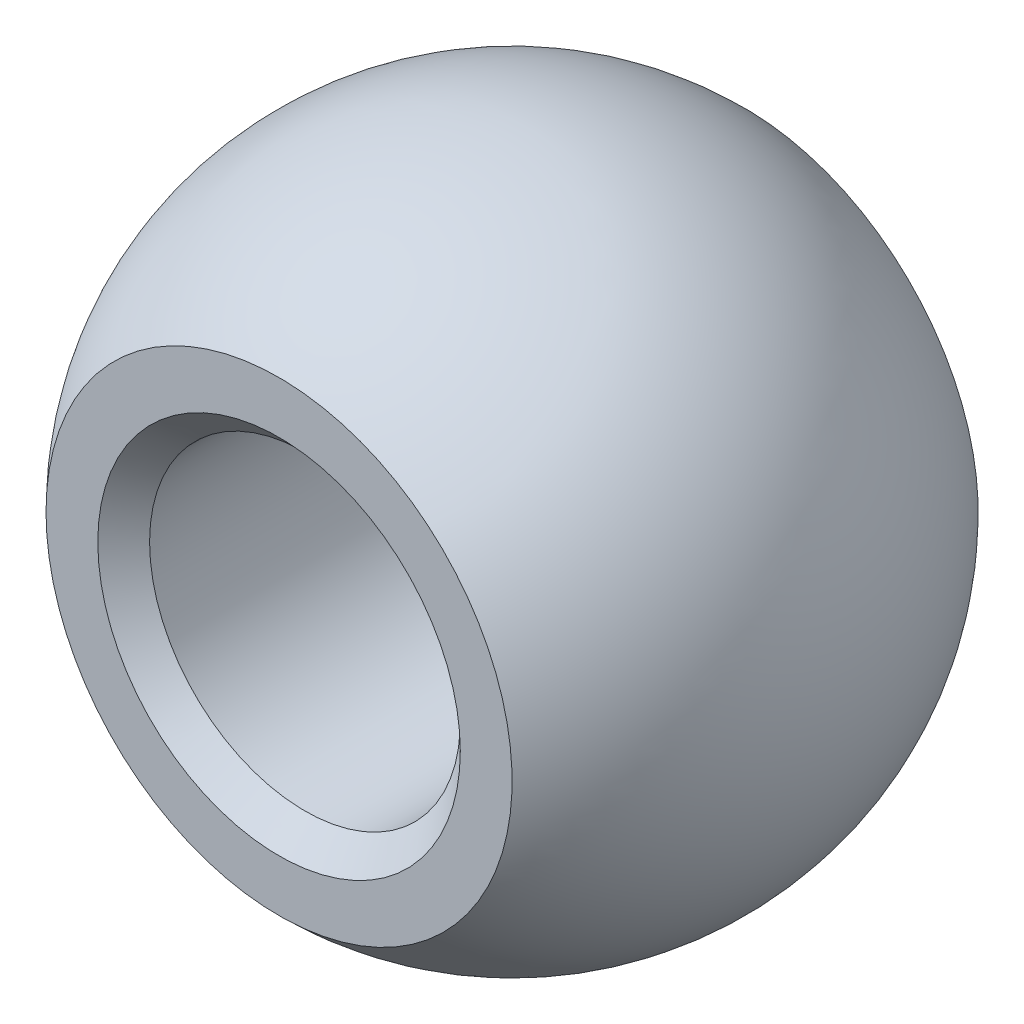
ISO-10303-21;
HEADER;
FILE_DESCRIPTION(('STEP AP214'),'2;1');
FILE_NAME('part.step','',(''),(''),'','','');
FILE_SCHEMA(('AUTOMOTIVE_DESIGN { 1 0 10303 214 1 1 1 1 }'));
ENDSEC;
DATA;
#1=APPLICATION_CONTEXT('core data for automotive mechanical design processes');
#2=APPLICATION_PROTOCOL_DEFINITION('international standard','automotive_design',2000,#1);
#3=PRODUCT_CONTEXT('',#1,'mechanical');
#4=PRODUCT('Part','Part','',(#3));
#5=PRODUCT_RELATED_PRODUCT_CATEGORY('part','',(#4));
#6=PRODUCT_DEFINITION_FORMATION('','',#4);
#7=PRODUCT_DEFINITION_CONTEXT('part definition',#1,'design');
#8=PRODUCT_DEFINITION('design','',#6,#7);
#9=PRODUCT_DEFINITION_SHAPE('','',#8);
#10=(LENGTH_UNIT() NAMED_UNIT(*) SI_UNIT(.MILLI.,.METRE.));
#11=(NAMED_UNIT(*) PLANE_ANGLE_UNIT() SI_UNIT($,.RADIAN.));
#12=(NAMED_UNIT(*) SI_UNIT($,.STERADIAN.) SOLID_ANGLE_UNIT());
#13=UNCERTAINTY_MEASURE_WITH_UNIT(LENGTH_MEASURE(1.E-05),#10,'distance_accuracy_value','');
#14=(GEOMETRIC_REPRESENTATION_CONTEXT(3) GLOBAL_UNCERTAINTY_ASSIGNED_CONTEXT((#13)) GLOBAL_UNIT_ASSIGNED_CONTEXT((#10,
#11,#12)) REPRESENTATION_CONTEXT('',''));
#15=CARTESIAN_POINT('',(0.,0.,0.));
#16=DIRECTION('',(0.,0.,1.));
#17=DIRECTION('',(1.,0.,0.));
#18=AXIS2_PLACEMENT_3D('',#15,#16,#17);
#19=CARTESIAN_POINT('',(0.,0.,-4.5));
#20=DIRECTION('',(0.,0.,-1.));
#21=DIRECTION('',(-1.,0.,0.));
#22=AXIS2_PLACEMENT_3D('',#19,#20,#21);
#23=PLANE('',#22);
#24=CARTESIAN_POINT('',(0.,0.,-4.5));
#25=DIRECTION('',(0.,0.,-1.));
#26=DIRECTION('',(-1.,0.,0.));
#27=AXIS2_PLACEMENT_3D('',#24,#25,#26);
#28=CIRCLE('',#27,3.5);
#29=CARTESIAN_POINT('',(-3.5,0.,-4.5));
#30=VERTEX_POINT('',#29);
#31=EDGE_CURVE('E10',#30,#30,#28,.F.);
#32=ORIENTED_EDGE('',*,*,#31,.T.);
#33=EDGE_LOOP('',(#32));
#34=FACE_BOUND('',#33,.T.);
#35=CARTESIAN_POINT('',(0.,0.,-4.5));
#36=DIRECTION('',(0.,0.,-1.));
#37=DIRECTION('',(-1.,0.,0.));
#38=AXIS2_PLACEMENT_3D('',#35,#36,#37);
#39=CIRCLE('',#38,4.5);
#40=CARTESIAN_POINT('',(-4.5,0.,-4.5));
#41=VERTEX_POINT('',#40);
#42=EDGE_CURVE('E51',#41,#41,#39,.T.);
#43=ORIENTED_EDGE('',*,*,#42,.T.);
#44=EDGE_LOOP('',(#43));
#45=FACE_BOUND('',#44,.T.);
#46=ADVANCED_FACE('F30',(#34,#45),#23,.T.);
#47=CARTESIAN_POINT('',(0.,0.,0.));
#48=DIRECTION('',(0.,-1.,0.));
#49=DIRECTION('',(0.,0.,1.));
#50=AXIS2_PLACEMENT_3D('',#47,#48,#49);
#51=SPHERICAL_SURFACE('',#50,6.36396103067893);
#52=CARTESIAN_POINT('',(0.,0.,0.));
#53=DIRECTION('',(0.,0.,-1.));
#54=DIRECTION('',(-1.,0.,0.));
#55=AXIS2_PLACEMENT_3D('',#52,#53,#54);
#56=SPHERICAL_SURFACE('',#55,6.36396103067893);
#57=ORIENTED_EDGE('',*,*,#42,.F.);
#58=EDGE_LOOP('',(#57));
#59=FACE_BOUND('',#58,.T.);
#60=CARTESIAN_POINT('',(0.,0.,4.5));
#61=DIRECTION('',(0.,0.,-1.));
#62=DIRECTION('',(-1.,0.,0.));
#63=AXIS2_PLACEMENT_3D('',#60,#61,#62);
#64=CIRCLE('',#63,4.5);
#65=CARTESIAN_POINT('',(-4.5,0.,4.5));
#66=VERTEX_POINT('',#65);
#67=EDGE_CURVE('E50',#66,#66,#64,.T.);
#68=ORIENTED_EDGE('',*,*,#67,.T.);
#69=EDGE_LOOP('',(#68));
#70=FACE_BOUND('',#69,.T.);
#71=ADVANCED_FACE('F57',(#59,#70),#56,.T.);
#72=CARTESIAN_POINT('',(0.,0.,4.5));
#73=DIRECTION('',(0.,0.,-1.));
#74=DIRECTION('',(-1.,0.,0.));
#75=AXIS2_PLACEMENT_3D('',#72,#73,#74);
#76=PLANE('',#75);
#77=CARTESIAN_POINT('',(0.,0.,4.5));
#78=DIRECTION('',(0.,0.,-1.));
#79=DIRECTION('',(-1.,0.,0.));
#80=AXIS2_PLACEMENT_3D('',#77,#78,#79);
#81=CIRCLE('',#80,3.5);
#82=CARTESIAN_POINT('',(-3.5,0.,4.5));
#83=VERTEX_POINT('',#82);
#84=EDGE_CURVE('E37',#83,#83,#81,.T.);
#85=ORIENTED_EDGE('',*,*,#84,.T.);
#86=EDGE_LOOP('',(#85));
#87=FACE_BOUND('',#86,.T.);
#88=ORIENTED_EDGE('',*,*,#67,.F.);
#89=EDGE_LOOP('',(#88));
#90=FACE_BOUND('',#89,.T.);
#91=ADVANCED_FACE('F59',(#87,#90),#76,.F.);
#92=CARTESIAN_POINT('',(0.,0.,-4.5));
#93=DIRECTION('',(0.,0.,1.));
#94=DIRECTION('',(1.,0.,0.));
#95=AXIS2_PLACEMENT_3D('',#92,#93,#94);
#96=CYLINDRICAL_SURFACE('',#95,3.);
#97=CARTESIAN_POINT('',(0.,0.,4.));
#98=DIRECTION('',(0.,0.,-1.));
#99=DIRECTION('',(-1.,0.,0.));
#100=AXIS2_PLACEMENT_3D('',#97,#98,#99);
#101=CIRCLE('',#100,3.);
#102=CARTESIAN_POINT('',(-3.,0.,4.));
#103=VERTEX_POINT('',#102);
#104=EDGE_CURVE('E41',#103,#103,#101,.F.);
#105=ORIENTED_EDGE('',*,*,#104,.T.);
#106=EDGE_LOOP('',(#105));
#107=FACE_BOUND('',#106,.T.);
#108=CARTESIAN_POINT('',(0.,0.,-4.));
#109=DIRECTION('',(0.,0.,-1.));
#110=DIRECTION('',(-1.,0.,0.));
#111=AXIS2_PLACEMENT_3D('',#108,#109,#110);
#112=CIRCLE('',#111,3.);
#113=CARTESIAN_POINT('',(-3.,0.,-4.));
#114=VERTEX_POINT('',#113);
#115=EDGE_CURVE('E45',#114,#114,#112,.T.);
#116=ORIENTED_EDGE('',*,*,#115,.T.);
#117=EDGE_LOOP('',(#116));
#118=FACE_BOUND('',#117,.T.);
#119=ADVANCED_FACE('F61',(#107,#118),#96,.F.);
#120=CARTESIAN_POINT('',(0.,0.,4.));
#121=DIRECTION('',(0.,0.,1.));
#122=DIRECTION('',(1.,0.,0.));
#123=AXIS2_PLACEMENT_3D('',#120,#121,#122);
#124=CONICAL_SURFACE('',#123,3.,0.785398163397451);
#125=ORIENTED_EDGE('',*,*,#84,.F.);
#126=EDGE_LOOP('',(#125));
#127=FACE_BOUND('',#126,.T.);
#128=ORIENTED_EDGE('',*,*,#104,.F.);
#129=EDGE_LOOP('',(#128));
#130=FACE_BOUND('',#129,.T.);
#131=ADVANCED_FACE('F67',(#127,#130),#124,.F.);
#132=CARTESIAN_POINT('',(0.,0.,-4.5));
#133=DIRECTION('',(0.,0.,-1.));
#134=DIRECTION('',(-1.,0.,0.));
#135=AXIS2_PLACEMENT_3D('',#132,#133,#134);
#136=CONICAL_SURFACE('',#135,3.5,0.785398163397449);
#137=ORIENTED_EDGE('',*,*,#115,.F.);
#138=EDGE_LOOP('',(#137));
#139=FACE_BOUND('',#138,.T.);
#140=ORIENTED_EDGE('',*,*,#31,.F.);
#141=EDGE_LOOP('',(#140));
#142=FACE_BOUND('',#141,.T.);
#143=ADVANCED_FACE('F32',(#139,#142),#136,.F.);
#144=CLOSED_SHELL('',(#46,#71,#91,#119,#131,#143));
#145=MANIFOLD_SOLID_BREP('B2',#144);
#146=ADVANCED_BREP_SHAPE_REPRESENTATION('',(#18,#145),#14);
#147=SHAPE_DEFINITION_REPRESENTATION(#9,#146);
ENDSEC;
END-ISO-10303-21;
